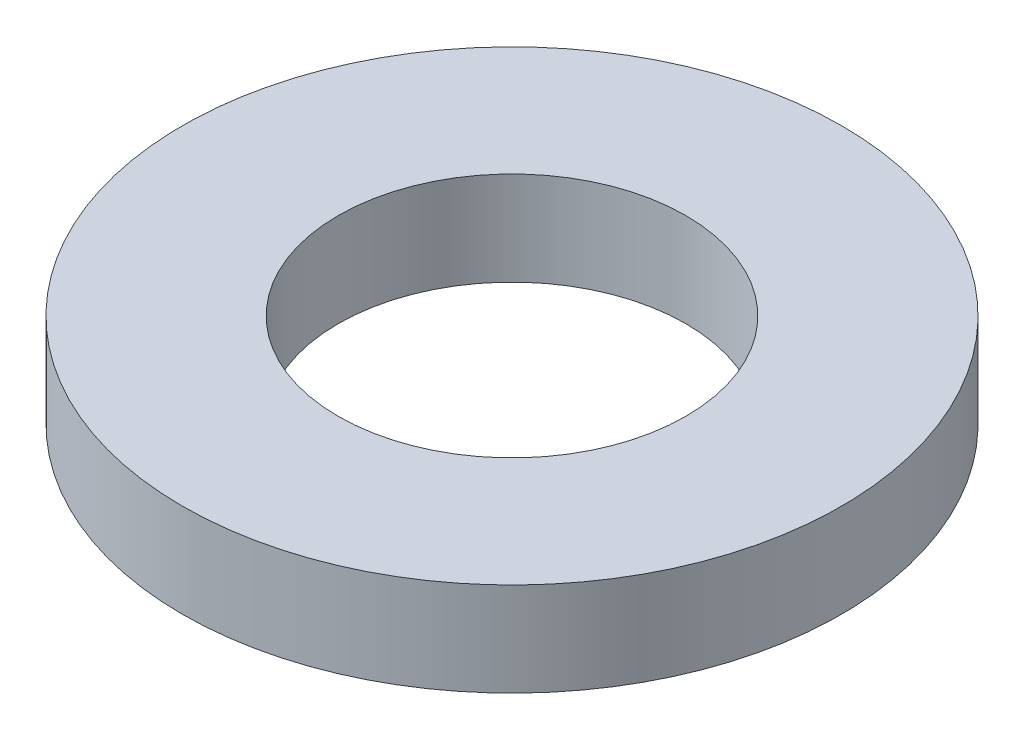
ISO-10303-21;
HEADER;
FILE_DESCRIPTION(('STEP AP214'),'2;1');
FILE_NAME('part.step','',(''),(''),'','','');
FILE_SCHEMA(('AUTOMOTIVE_DESIGN { 1 0 10303 214 1 1 1 1 }'));
ENDSEC;
DATA;
#1=APPLICATION_CONTEXT('core data for automotive mechanical design processes');
#2=APPLICATION_PROTOCOL_DEFINITION('international standard','automotive_design',2000,#1);
#3=PRODUCT_CONTEXT('',#1,'mechanical');
#4=PRODUCT('Part','Part','',(#3));
#5=PRODUCT_RELATED_PRODUCT_CATEGORY('part','',(#4));
#6=PRODUCT_DEFINITION_FORMATION('','',#4);
#7=PRODUCT_DEFINITION_CONTEXT('part definition',#1,'design');
#8=PRODUCT_DEFINITION('design','',#6,#7);
#9=PRODUCT_DEFINITION_SHAPE('','',#8);
#10=(LENGTH_UNIT() NAMED_UNIT(*) SI_UNIT(.MILLI.,.METRE.));
#11=(NAMED_UNIT(*) PLANE_ANGLE_UNIT() SI_UNIT($,.RADIAN.));
#12=(NAMED_UNIT(*) SI_UNIT($,.STERADIAN.) SOLID_ANGLE_UNIT());
#13=UNCERTAINTY_MEASURE_WITH_UNIT(LENGTH_MEASURE(1.E-05),#10,'distance_accuracy_value','');
#14=(GEOMETRIC_REPRESENTATION_CONTEXT(3) GLOBAL_UNCERTAINTY_ASSIGNED_CONTEXT((#13)) GLOBAL_UNIT_ASSIGNED_CONTEXT((#10,
#11,#12)) REPRESENTATION_CONTEXT('',''));
#15=CARTESIAN_POINT('',(0.,0.,0.));
#16=DIRECTION('',(0.,0.,1.));
#17=DIRECTION('',(1.,0.,0.));
#18=AXIS2_PLACEMENT_3D('',#15,#16,#17);
#19=CARTESIAN_POINT('',(0.,1.,0.));
#20=DIRECTION('',(0.,-1.,0.));
#21=DIRECTION('',(0.,0.,-1.));
#22=AXIS2_PLACEMENT_3D('',#19,#20,#21);
#23=CYLINDRICAL_SURFACE('',#22,3.51875);
#24=CARTESIAN_POINT('',(0.,1.,0.));
#25=DIRECTION('',(0.,1.,0.));
#26=DIRECTION('',(0.,0.,1.));
#27=AXIS2_PLACEMENT_3D('',#24,#25,#26);
#28=CIRCLE('',#27,3.51875);
#29=CARTESIAN_POINT('',(0.,1.,3.51875));
#30=VERTEX_POINT('',#29);
#31=EDGE_CURVE('E10',#30,#30,#28,.T.);
#32=ORIENTED_EDGE('',*,*,#31,.F.);
#33=EDGE_LOOP('',(#32));
#34=FACE_BOUND('',#33,.T.);
#35=CARTESIAN_POINT('',(0.,0.,0.));
#36=DIRECTION('',(0.,1.,0.));
#37=DIRECTION('',(0.,0.,1.));
#38=AXIS2_PLACEMENT_3D('',#35,#36,#37);
#39=CIRCLE('',#38,3.51875);
#40=CARTESIAN_POINT('',(0.,0.,3.51875));
#41=VERTEX_POINT('',#40);
#42=EDGE_CURVE('E33',#41,#41,#39,.T.);
#43=ORIENTED_EDGE('',*,*,#42,.T.);
#44=EDGE_LOOP('',(#43));
#45=FACE_BOUND('',#44,.T.);
#46=ADVANCED_FACE('F30',(#34,#45),#23,.T.);
#47=CARTESIAN_POINT('',(0.,1.,0.));
#48=DIRECTION('',(0.,1.,0.));
#49=DIRECTION('',(0.,0.,1.));
#50=AXIS2_PLACEMENT_3D('',#47,#48,#49);
#51=PLANE('',#50);
#52=CARTESIAN_POINT('',(0.,1.,0.));
#53=DIRECTION('',(0.,1.,0.));
#54=DIRECTION('',(0.,0.,1.));
#55=AXIS2_PLACEMENT_3D('',#52,#53,#54);
#56=CIRCLE('',#55,1.85625);
#57=CARTESIAN_POINT('',(0.,1.,1.85625));
#58=VERTEX_POINT('',#57);
#59=EDGE_CURVE('E42',#58,#58,#56,.T.);
#60=ORIENTED_EDGE('',*,*,#59,.F.);
#61=EDGE_LOOP('',(#60));
#62=FACE_BOUND('',#61,.T.);
#63=ORIENTED_EDGE('',*,*,#31,.T.);
#64=EDGE_LOOP('',(#63));
#65=FACE_BOUND('',#64,.T.);
#66=ADVANCED_FACE('F57',(#62,#65),#51,.T.);
#67=CARTESIAN_POINT('',(0.,0.,0.));
#68=DIRECTION('',(0.,1.,0.));
#69=DIRECTION('',(0.,0.,1.));
#70=AXIS2_PLACEMENT_3D('',#67,#68,#69);
#71=PLANE('',#70);
#72=CARTESIAN_POINT('',(0.,0.,0.));
#73=DIRECTION('',(0.,1.,0.));
#74=DIRECTION('',(0.,0.,1.));
#75=AXIS2_PLACEMENT_3D('',#72,#73,#74);
#76=CIRCLE('',#75,1.85625);
#77=CARTESIAN_POINT('',(0.,0.,1.85625));
#78=VERTEX_POINT('',#77);
#79=EDGE_CURVE('E40',#78,#78,#76,.T.);
#80=ORIENTED_EDGE('',*,*,#79,.T.);
#81=EDGE_LOOP('',(#80));
#82=FACE_BOUND('',#81,.T.);
#83=ORIENTED_EDGE('',*,*,#42,.F.);
#84=EDGE_LOOP('',(#83));
#85=FACE_BOUND('',#84,.T.);
#86=ADVANCED_FACE('F48',(#82,#85),#71,.F.);
#87=CARTESIAN_POINT('',(0.,0.,0.));
#88=DIRECTION('',(0.,1.,0.));
#89=DIRECTION('',(0.,0.,1.));
#90=AXIS2_PLACEMENT_3D('',#87,#88,#89);
#91=CYLINDRICAL_SURFACE('',#90,1.85625);
#92=ORIENTED_EDGE('',*,*,#79,.F.);
#93=EDGE_LOOP('',(#92));
#94=FACE_BOUND('',#93,.T.);
#95=ORIENTED_EDGE('',*,*,#59,.T.);
#96=EDGE_LOOP('',(#95));
#97=FACE_BOUND('',#96,.T.);
#98=ADVANCED_FACE('F51',(#94,#97),#91,.F.);
#99=CLOSED_SHELL('',(#46,#66,#86,#98));
#100=MANIFOLD_SOLID_BREP('B2',#99);
#101=ADVANCED_BREP_SHAPE_REPRESENTATION('',(#18,#100),#14);
#102=SHAPE_DEFINITION_REPRESENTATION(#9,#101);
ENDSEC;
END-ISO-10303-21;
